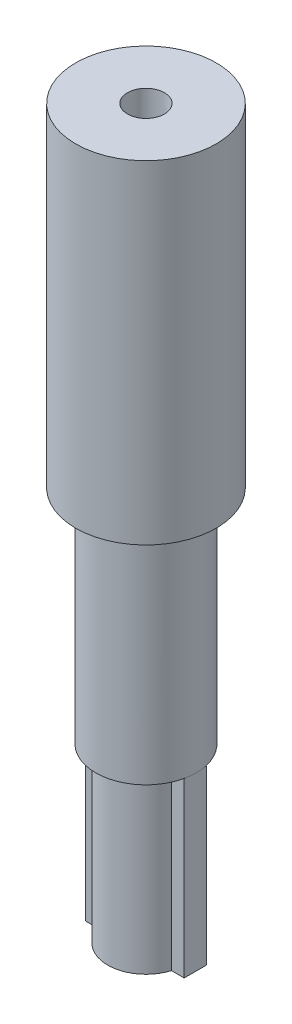
ISO-10303-21;
HEADER;
FILE_DESCRIPTION(('STEP AP214'),'2;1');
FILE_NAME('part.step','',(''),(''),'','','');
FILE_SCHEMA(('AUTOMOTIVE_DESIGN { 1 0 10303 214 1 1 1 1 }'));
ENDSEC;
DATA;
#1=APPLICATION_CONTEXT('core data for automotive mechanical design processes');
#2=APPLICATION_PROTOCOL_DEFINITION('international standard','automotive_design',2000,#1);
#3=PRODUCT_CONTEXT('',#1,'mechanical');
#4=PRODUCT('Part','Part','',(#3));
#5=PRODUCT_RELATED_PRODUCT_CATEGORY('part','',(#4));
#6=PRODUCT_DEFINITION_FORMATION('','',#4);
#7=PRODUCT_DEFINITION_CONTEXT('part definition',#1,'design');
#8=PRODUCT_DEFINITION('design','',#6,#7);
#9=PRODUCT_DEFINITION_SHAPE('','',#8);
#10=(LENGTH_UNIT() NAMED_UNIT(*) SI_UNIT(.MILLI.,.METRE.));
#11=(NAMED_UNIT(*) PLANE_ANGLE_UNIT() SI_UNIT($,.RADIAN.));
#12=(NAMED_UNIT(*) SI_UNIT($,.STERADIAN.) SOLID_ANGLE_UNIT());
#13=UNCERTAINTY_MEASURE_WITH_UNIT(LENGTH_MEASURE(1.E-05),#10,'distance_accuracy_value','');
#14=(GEOMETRIC_REPRESENTATION_CONTEXT(3) GLOBAL_UNCERTAINTY_ASSIGNED_CONTEXT((#13)) GLOBAL_UNIT_ASSIGNED_CONTEXT((#10,
#11,#12)) REPRESENTATION_CONTEXT('',''));
#15=CARTESIAN_POINT('',(0.,0.,0.));
#16=DIRECTION('',(0.,0.,1.));
#17=DIRECTION('',(1.,0.,0.));
#18=AXIS2_PLACEMENT_3D('',#15,#16,#17);
#19=CARTESIAN_POINT('',(0.,14.,0.));
#20=DIRECTION('',(0.,1.,0.));
#21=DIRECTION('',(0.,0.,1.));
#22=AXIS2_PLACEMENT_3D('',#19,#20,#21);
#23=PLANE('',#22);
#24=CARTESIAN_POINT('',(0.,14.,0.));
#25=DIRECTION('',(0.,1.,0.));
#26=DIRECTION('',(0.,0.,1.));
#27=AXIS2_PLACEMENT_3D('',#24,#25,#26);
#28=CIRCLE('',#27,4.075);
#29=CARTESIAN_POINT('',(3.9743710194193,14.,0.9));
#30=VERTEX_POINT('',#29);
#31=CARTESIAN_POINT('',(4.,14.,0.778219120813672));
#32=VERTEX_POINT('',#31);
#33=EDGE_CURVE('E160',#30,#32,#28,.T.);
#34=ORIENTED_EDGE('',*,*,#33,.F.);
#35=DIRECTION('',(1.,0.,0.));
#36=VECTOR('',#35,1.);
#37=CARTESIAN_POINT('',(0.,14.,0.9));
#38=LINE('',#37,#36);
#39=CARTESIAN_POINT('',(4.,14.,0.9));
#40=VERTEX_POINT('',#39);
#41=EDGE_CURVE('E246',#30,#40,#38,.T.);
#42=ORIENTED_EDGE('',*,*,#41,.T.);
#43=DIRECTION('',(0.,0.,1.));
#44=VECTOR('',#43,1.);
#45=CARTESIAN_POINT('',(4.,14.,0.));
#46=LINE('',#45,#44);
#47=EDGE_CURVE('E244',#32,#40,#46,.T.);
#48=ORIENTED_EDGE('',*,*,#47,.F.);
#49=EDGE_LOOP('',(#34,#42,#48));
#50=FACE_BOUND('',#49,.T.);
#51=ADVANCED_FACE('F41',(#50),#23,.T.);
#52=CARTESIAN_POINT('',(4.,14.,-0.778219120813672));
#53=VERTEX_POINT('',#52);
#54=CARTESIAN_POINT('',(3.9743710194193,14.,-0.9));
#55=VERTEX_POINT('',#54);
#56=EDGE_CURVE('E11',#53,#55,#28,.T.);
#57=ORIENTED_EDGE('',*,*,#56,.F.);
#58=CARTESIAN_POINT('',(4.,14.,-0.9));
#59=VERTEX_POINT('',#58);
#60=EDGE_CURVE('E251',#59,#53,#46,.T.);
#61=ORIENTED_EDGE('',*,*,#60,.F.);
#62=DIRECTION('',(1.,0.,0.));
#63=VECTOR('',#62,1.);
#64=CARTESIAN_POINT('',(0.,14.,-0.9));
#65=LINE('',#64,#63);
#66=EDGE_CURVE('E252',#55,#59,#65,.T.);
#67=ORIENTED_EDGE('',*,*,#66,.F.);
#68=EDGE_LOOP('',(#57,#61,#67));
#69=FACE_BOUND('',#68,.T.);
#70=ADVANCED_FACE('F257',(#69),#23,.T.);
#71=CARTESIAN_POINT('',(-3.9743710194193,14.,-0.9));
#72=VERTEX_POINT('',#71);
#73=CARTESIAN_POINT('',(-4.,14.,-0.778219120813672));
#74=VERTEX_POINT('',#73);
#75=EDGE_CURVE('E50',#72,#74,#28,.T.);
#76=ORIENTED_EDGE('',*,*,#75,.F.);
#77=DIRECTION('',(1.,0.,0.));
#78=VECTOR('',#77,1.);
#79=CARTESIAN_POINT('',(0.,14.,-0.9));
#80=LINE('',#79,#78);
#81=CARTESIAN_POINT('',(-4.,14.,-0.9));
#82=VERTEX_POINT('',#81);
#83=EDGE_CURVE('E188',#82,#72,#80,.T.);
#84=ORIENTED_EDGE('',*,*,#83,.F.);
#85=DIRECTION('',(0.,0.,1.));
#86=VECTOR('',#85,1.);
#87=CARTESIAN_POINT('',(-4.,14.,0.));
#88=LINE('',#87,#86);
#89=EDGE_CURVE('E193',#82,#74,#88,.T.);
#90=ORIENTED_EDGE('',*,*,#89,.T.);
#91=EDGE_LOOP('',(#76,#84,#90));
#92=FACE_BOUND('',#91,.T.);
#93=ADVANCED_FACE('F277',(#92),#23,.T.);
#94=CARTESIAN_POINT('',(0.,14.,0.9));
#95=DIRECTION('',(0.,0.,-1.));
#96=DIRECTION('',(-1.,0.,0.));
#97=AXIS2_PLACEMENT_3D('',#94,#95,#96);
#98=PLANE('',#97);
#99=DIRECTION('',(1.,0.,0.));
#100=VECTOR('',#99,1.);
#101=CARTESIAN_POINT('',(0.,0.,0.9));
#102=LINE('',#101,#100);
#103=CARTESIAN_POINT('',(-4.,0.,0.9));
#104=VERTEX_POINT('',#103);
#105=CARTESIAN_POINT('',(-2.96647939483826,0.,0.9));
#106=VERTEX_POINT('',#105);
#107=EDGE_CURVE('E170',#104,#106,#102,.T.);
#108=ORIENTED_EDGE('',*,*,#107,.T.);
#109=DIRECTION('',(0.,-1.,0.));
#110=VECTOR('',#109,1.);
#111=CARTESIAN_POINT('',(-2.96647939483826,14.,0.9));
#112=LINE('',#111,#110);
#113=CARTESIAN_POINT('',(-2.96647939483826,14.,0.9));
#114=VERTEX_POINT('',#113);
#115=EDGE_CURVE('E45',#114,#106,#112,.T.);
#116=ORIENTED_EDGE('',*,*,#115,.F.);
#117=DIRECTION('',(1.,0.,0.));
#118=VECTOR('',#117,1.);
#119=CARTESIAN_POINT('',(0.,14.,0.9));
#120=LINE('',#119,#118);
#121=CARTESIAN_POINT('',(-3.9743710194193,14.,0.9));
#122=VERTEX_POINT('',#121);
#123=EDGE_CURVE('E140',#122,#114,#120,.T.);
#124=ORIENTED_EDGE('',*,*,#123,.F.);
#125=CARTESIAN_POINT('',(-4.,14.,0.9));
#126=VERTEX_POINT('',#125);
#127=EDGE_CURVE('E132',#126,#122,#120,.T.);
#128=ORIENTED_EDGE('',*,*,#127,.F.);
#129=DIRECTION('',(0.,-1.,0.));
#130=VECTOR('',#129,1.);
#131=CARTESIAN_POINT('',(-4.,14.,0.9));
#132=LINE('',#131,#130);
#133=EDGE_CURVE('E195',#126,#104,#132,.T.);
#134=ORIENTED_EDGE('',*,*,#133,.T.);
#135=EDGE_LOOP('',(#108,#116,#124,#128,#134));
#136=FACE_BOUND('',#135,.T.);
#137=ADVANCED_FACE('F43',(#136),#98,.F.);
#138=CARTESIAN_POINT('',(0.,14.,0.));
#139=DIRECTION('',(0.,-1.,0.));
#140=DIRECTION('',(0.,0.,-1.));
#141=AXIS2_PLACEMENT_3D('',#138,#139,#140);
#142=CYLINDRICAL_SURFACE('',#141,3.1);
#143=CARTESIAN_POINT('',(0.,0.,0.));
#144=DIRECTION('',(0.,1.,0.));
#145=DIRECTION('',(0.,0.,1.));
#146=AXIS2_PLACEMENT_3D('',#143,#144,#145);
#147=CIRCLE('',#146,3.1);
#148=CARTESIAN_POINT('',(2.96647939483826,0.,0.9));
#149=VERTEX_POINT('',#148);
#150=EDGE_CURVE('E197',#106,#149,#147,.T.);
#151=ORIENTED_EDGE('',*,*,#150,.T.);
#152=DIRECTION('',(0.,-1.,0.));
#153=VECTOR('',#152,1.);
#154=CARTESIAN_POINT('',(2.96647939483826,14.,0.9));
#155=LINE('',#154,#153);
#156=CARTESIAN_POINT('',(2.96647939483826,14.,0.9));
#157=VERTEX_POINT('',#156);
#158=EDGE_CURVE('E165',#157,#149,#155,.T.);
#159=ORIENTED_EDGE('',*,*,#158,.F.);
#160=CARTESIAN_POINT('',(0.,14.,0.));
#161=DIRECTION('',(0.,1.,0.));
#162=DIRECTION('',(0.,0.,1.));
#163=AXIS2_PLACEMENT_3D('',#160,#161,#162);
#164=CIRCLE('',#163,3.1);
#165=EDGE_CURVE('E139',#114,#157,#164,.T.);
#166=ORIENTED_EDGE('',*,*,#165,.F.);
#167=ORIENTED_EDGE('',*,*,#115,.T.);
#168=EDGE_LOOP('',(#151,#159,#166,#167));
#169=FACE_BOUND('',#168,.T.);
#170=ADVANCED_FACE('F291',(#169),#142,.T.);
#171=CARTESIAN_POINT('',(0.,14.,0.9));
#172=DIRECTION('',(0.,0.,-1.));
#173=DIRECTION('',(-1.,0.,0.));
#174=AXIS2_PLACEMENT_3D('',#171,#172,#173);
#175=PLANE('',#174);
#176=DIRECTION('',(1.,0.,0.));
#177=VECTOR('',#176,1.);
#178=CARTESIAN_POINT('',(0.,0.,0.9));
#179=LINE('',#178,#177);
#180=CARTESIAN_POINT('',(4.,0.,0.9));
#181=VERTEX_POINT('',#180);
#182=EDGE_CURVE('E199',#149,#181,#179,.T.);
#183=ORIENTED_EDGE('',*,*,#182,.T.);
#184=DIRECTION('',(0.,-1.,0.));
#185=VECTOR('',#184,1.);
#186=CARTESIAN_POINT('',(4.,14.,0.9));
#187=LINE('',#186,#185);
#188=EDGE_CURVE('E224',#40,#181,#187,.T.);
#189=ORIENTED_EDGE('',*,*,#188,.F.);
#190=ORIENTED_EDGE('',*,*,#41,.F.);
#191=EDGE_CURVE('E155',#157,#30,#38,.T.);
#192=ORIENTED_EDGE('',*,*,#191,.F.);
#193=ORIENTED_EDGE('',*,*,#158,.T.);
#194=EDGE_LOOP('',(#183,#189,#190,#192,#193));
#195=FACE_BOUND('',#194,.T.);
#196=ADVANCED_FACE('F228',(#195),#175,.F.);
#197=CARTESIAN_POINT('',(4.,14.,0.));
#198=DIRECTION('',(1.,0.,0.));
#199=DIRECTION('',(0.,0.,-1.));
#200=AXIS2_PLACEMENT_3D('',#197,#198,#199);
#201=PLANE('',#200);
#202=DIRECTION('',(0.,0.,1.));
#203=VECTOR('',#202,1.);
#204=CARTESIAN_POINT('',(4.,0.,0.));
#205=LINE('',#204,#203);
#206=CARTESIAN_POINT('',(4.,0.,-0.9));
#207=VERTEX_POINT('',#206);
#208=EDGE_CURVE('E202',#207,#181,#205,.T.);
#209=ORIENTED_EDGE('',*,*,#208,.F.);
#210=DIRECTION('',(0.,-1.,0.));
#211=VECTOR('',#210,1.);
#212=CARTESIAN_POINT('',(4.,14.,-0.9));
#213=LINE('',#212,#211);
#214=EDGE_CURVE('E222',#59,#207,#213,.T.);
#215=ORIENTED_EDGE('',*,*,#214,.F.);
#216=ORIENTED_EDGE('',*,*,#60,.T.);
#217=EDGE_CURVE('E253',#53,#32,#46,.T.);
#218=ORIENTED_EDGE('',*,*,#217,.T.);
#219=ORIENTED_EDGE('',*,*,#47,.T.);
#220=ORIENTED_EDGE('',*,*,#188,.T.);
#221=EDGE_LOOP('',(#209,#215,#216,#218,#219,#220));
#222=FACE_BOUND('',#221,.T.);
#223=ADVANCED_FACE('F240',(#222),#201,.T.);
#224=CARTESIAN_POINT('',(0.,14.,-0.9));
#225=DIRECTION('',(0.,0.,-1.));
#226=DIRECTION('',(-1.,0.,0.));
#227=AXIS2_PLACEMENT_3D('',#224,#225,#226);
#228=PLANE('',#227);
#229=DIRECTION('',(1.,0.,0.));
#230=VECTOR('',#229,1.);
#231=CARTESIAN_POINT('',(0.,0.,-0.9));
#232=LINE('',#231,#230);
#233=CARTESIAN_POINT('',(2.96647939483826,0.,-0.9));
#234=VERTEX_POINT('',#233);
#235=EDGE_CURVE('E205',#234,#207,#232,.T.);
#236=ORIENTED_EDGE('',*,*,#235,.F.);
#237=DIRECTION('',(0.,-1.,0.));
#238=VECTOR('',#237,1.);
#239=CARTESIAN_POINT('',(2.96647939483826,14.,-0.9));
#240=LINE('',#239,#238);
#241=CARTESIAN_POINT('',(2.96647939483826,14.,-0.9));
#242=VERTEX_POINT('',#241);
#243=EDGE_CURVE('E220',#242,#234,#240,.T.);
#244=ORIENTED_EDGE('',*,*,#243,.F.);
#245=EDGE_CURVE('E181',#242,#55,#65,.T.);
#246=ORIENTED_EDGE('',*,*,#245,.T.);
#247=ORIENTED_EDGE('',*,*,#66,.T.);
#248=ORIENTED_EDGE('',*,*,#214,.T.);
#249=EDGE_LOOP('',(#236,#244,#246,#247,#248));
#250=FACE_BOUND('',#249,.T.);
#251=ADVANCED_FACE('F255',(#250),#228,.T.);
#252=CARTESIAN_POINT('',(0.,14.,0.));
#253=DIRECTION('',(0.,-1.,0.));
#254=DIRECTION('',(0.,0.,-1.));
#255=AXIS2_PLACEMENT_3D('',#252,#253,#254);
#256=CYLINDRICAL_SURFACE('',#255,3.1);
#257=CARTESIAN_POINT('',(0.,0.,0.));
#258=DIRECTION('',(0.,1.,0.));
#259=DIRECTION('',(0.,0.,1.));
#260=AXIS2_PLACEMENT_3D('',#257,#258,#259);
#261=CIRCLE('',#260,3.1);
#262=CARTESIAN_POINT('',(-2.96647939483826,0.,-0.9));
#263=VERTEX_POINT('',#262);
#264=EDGE_CURVE('E208',#234,#263,#261,.T.);
#265=ORIENTED_EDGE('',*,*,#264,.T.);
#266=DIRECTION('',(0.,-1.,0.));
#267=VECTOR('',#266,1.);
#268=CARTESIAN_POINT('',(-2.96647939483826,14.,-0.9));
#269=LINE('',#268,#267);
#270=CARTESIAN_POINT('',(-2.96647939483826,14.,-0.9));
#271=VERTEX_POINT('',#270);
#272=EDGE_CURVE('E218',#271,#263,#269,.T.);
#273=ORIENTED_EDGE('',*,*,#272,.F.);
#274=CARTESIAN_POINT('',(0.,14.,0.));
#275=DIRECTION('',(0.,1.,0.));
#276=DIRECTION('',(0.,0.,1.));
#277=AXIS2_PLACEMENT_3D('',#274,#275,#276);
#278=CIRCLE('',#277,3.1);
#279=EDGE_CURVE('E184',#242,#271,#278,.T.);
#280=ORIENTED_EDGE('',*,*,#279,.F.);
#281=ORIENTED_EDGE('',*,*,#243,.T.);
#282=EDGE_LOOP('',(#265,#273,#280,#281));
#283=FACE_BOUND('',#282,.T.);
#284=ADVANCED_FACE('F296',(#283),#256,.T.);
#285=CARTESIAN_POINT('',(0.,14.,-0.9));
#286=DIRECTION('',(0.,0.,-1.));
#287=DIRECTION('',(-1.,0.,0.));
#288=AXIS2_PLACEMENT_3D('',#285,#286,#287);
#289=PLANE('',#288);
#290=DIRECTION('',(1.,0.,0.));
#291=VECTOR('',#290,1.);
#292=CARTESIAN_POINT('',(0.,0.,-0.9));
#293=LINE('',#292,#291);
#294=CARTESIAN_POINT('',(-4.,0.,-0.9));
#295=VERTEX_POINT('',#294);
#296=EDGE_CURVE('E211',#295,#263,#293,.T.);
#297=ORIENTED_EDGE('',*,*,#296,.F.);
#298=DIRECTION('',(0.,-1.,0.));
#299=VECTOR('',#298,1.);
#300=CARTESIAN_POINT('',(-4.,14.,-0.9));
#301=LINE('',#300,#299);
#302=EDGE_CURVE('E216',#82,#295,#301,.T.);
#303=ORIENTED_EDGE('',*,*,#302,.F.);
#304=ORIENTED_EDGE('',*,*,#83,.T.);
#305=EDGE_CURVE('E182',#72,#271,#80,.T.);
#306=ORIENTED_EDGE('',*,*,#305,.T.);
#307=ORIENTED_EDGE('',*,*,#272,.T.);
#308=EDGE_LOOP('',(#297,#303,#304,#306,#307));
#309=FACE_BOUND('',#308,.T.);
#310=ADVANCED_FACE('F284',(#309),#289,.T.);
#311=CARTESIAN_POINT('',(-4.,14.,0.));
#312=DIRECTION('',(1.,0.,0.));
#313=DIRECTION('',(0.,0.,-1.));
#314=AXIS2_PLACEMENT_3D('',#311,#312,#313);
#315=PLANE('',#314);
#316=DIRECTION('',(0.,0.,1.));
#317=VECTOR('',#316,1.);
#318=CARTESIAN_POINT('',(-4.,0.,0.));
#319=LINE('',#318,#317);
#320=EDGE_CURVE('E149',#295,#104,#319,.T.);
#321=ORIENTED_EDGE('',*,*,#320,.T.);
#322=ORIENTED_EDGE('',*,*,#133,.F.);
#323=CARTESIAN_POINT('',(-4.,14.,0.778219120813672));
#324=VERTEX_POINT('',#323);
#325=EDGE_CURVE('E135',#324,#126,#88,.T.);
#326=ORIENTED_EDGE('',*,*,#325,.F.);
#327=EDGE_CURVE('E66',#74,#324,#88,.T.);
#328=ORIENTED_EDGE('',*,*,#327,.F.);
#329=ORIENTED_EDGE('',*,*,#89,.F.);
#330=ORIENTED_EDGE('',*,*,#302,.T.);
#331=EDGE_LOOP('',(#321,#322,#326,#328,#329,#330));
#332=FACE_BOUND('',#331,.T.);
#333=ADVANCED_FACE('F280',(#332),#315,.F.);
#334=EDGE_CURVE('E59',#324,#122,#28,.T.);
#335=ORIENTED_EDGE('',*,*,#334,.F.);
#336=ORIENTED_EDGE('',*,*,#325,.T.);
#337=ORIENTED_EDGE('',*,*,#127,.T.);
#338=EDGE_LOOP('',(#335,#336,#337));
#339=FACE_BOUND('',#338,.T.);
#340=ADVANCED_FACE('F134',(#339),#23,.T.);
#341=CARTESIAN_POINT('',(0.,0.,0.));
#342=DIRECTION('',(0.,1.,0.));
#343=DIRECTION('',(0.,0.,1.));
#344=AXIS2_PLACEMENT_3D('',#341,#342,#343);
#345=PLANE('',#344);
#346=ORIENTED_EDGE('',*,*,#107,.F.);
#347=ORIENTED_EDGE('',*,*,#320,.F.);
#348=ORIENTED_EDGE('',*,*,#296,.T.);
#349=ORIENTED_EDGE('',*,*,#264,.F.);
#350=ORIENTED_EDGE('',*,*,#235,.T.);
#351=ORIENTED_EDGE('',*,*,#208,.T.);
#352=ORIENTED_EDGE('',*,*,#182,.F.);
#353=ORIENTED_EDGE('',*,*,#150,.F.);
#354=EDGE_LOOP('',(#346,#347,#348,#349,#350,#351,#352,#353));
#355=FACE_BOUND('',#354,.T.);
#356=ADVANCED_FACE('F234',(#355),#345,.F.);
#357=CARTESIAN_POINT('',(0.,14.,0.));
#358=DIRECTION('',(0.,1.,0.));
#359=DIRECTION('',(0.,0.,1.));
#360=AXIS2_PLACEMENT_3D('',#357,#358,#359);
#361=PLANE('',#360);
#362=EDGE_CURVE('E152',#122,#30,#28,.T.);
#363=ORIENTED_EDGE('',*,*,#362,.F.);
#364=ORIENTED_EDGE('',*,*,#123,.T.);
#365=ORIENTED_EDGE('',*,*,#165,.T.);
#366=ORIENTED_EDGE('',*,*,#191,.T.);
#367=EDGE_LOOP('',(#363,#364,#365,#366));
#368=FACE_BOUND('',#367,.T.);
#369=ADVANCED_FACE('F153',(#368),#361,.F.);
#370=ORIENTED_EDGE('',*,*,#217,.F.);
#371=EDGE_CURVE('E52',#32,#53,#28,.T.);
#372=ORIENTED_EDGE('',*,*,#371,.F.);
#373=EDGE_LOOP('',(#370,#372));
#374=FACE_BOUND('',#373,.T.);
#375=ADVANCED_FACE('F260',(#374),#361,.F.);
#376=EDGE_CURVE('E158',#74,#324,#28,.T.);
#377=ORIENTED_EDGE('',*,*,#376,.F.);
#378=ORIENTED_EDGE('',*,*,#327,.T.);
#379=EDGE_LOOP('',(#377,#378));
#380=FACE_BOUND('',#379,.T.);
#381=ADVANCED_FACE('F262',(#380),#361,.F.);
#382=CARTESIAN_POINT('',(0.,32.,0.));
#383=DIRECTION('',(0.,-1.,0.));
#384=DIRECTION('',(0.,0.,-1.));
#385=AXIS2_PLACEMENT_3D('',#382,#383,#384);
#386=CYLINDRICAL_SURFACE('',#385,4.075);
#387=CARTESIAN_POINT('',(0.,32.,0.));
#388=DIRECTION('',(0.,1.,0.));
#389=DIRECTION('',(0.,0.,1.));
#390=AXIS2_PLACEMENT_3D('',#387,#388,#389);
#391=CIRCLE('',#390,4.075);
#392=CARTESIAN_POINT('',(0.,32.,4.075));
#393=VERTEX_POINT('',#392);
#394=EDGE_CURVE('E167',#393,#393,#391,.T.);
#395=ORIENTED_EDGE('',*,*,#394,.F.);
#396=EDGE_LOOP('',(#395));
#397=FACE_BOUND('',#396,.T.);
#398=ORIENTED_EDGE('',*,*,#33,.T.);
#399=ORIENTED_EDGE('',*,*,#371,.T.);
#400=ORIENTED_EDGE('',*,*,#56,.T.);
#401=EDGE_CURVE('E171',#55,#72,#28,.T.);
#402=ORIENTED_EDGE('',*,*,#401,.T.);
#403=ORIENTED_EDGE('',*,*,#75,.T.);
#404=ORIENTED_EDGE('',*,*,#376,.T.);
#405=ORIENTED_EDGE('',*,*,#334,.T.);
#406=ORIENTED_EDGE('',*,*,#362,.T.);
#407=EDGE_LOOP('',(#398,#399,#400,#402,#403,#404,#405,#406));
#408=FACE_BOUND('',#407,.T.);
#409=ADVANCED_FACE('F162',(#397,#408),#386,.T.);
#410=ORIENTED_EDGE('',*,*,#245,.F.);
#411=ORIENTED_EDGE('',*,*,#279,.T.);
#412=ORIENTED_EDGE('',*,*,#305,.F.);
#413=ORIENTED_EDGE('',*,*,#401,.F.);
#414=EDGE_LOOP('',(#410,#411,#412,#413));
#415=FACE_BOUND('',#414,.T.);
#416=ADVANCED_FACE('F178',(#415),#361,.F.);
#417=CARTESIAN_POINT('',(0.,34.,0.));
#418=DIRECTION('',(0.,-1.,0.));
#419=DIRECTION('',(0.,0.,-1.));
#420=AXIS2_PLACEMENT_3D('',#417,#418,#419);
#421=CYLINDRICAL_SURFACE('',#420,5.7);
#422=CARTESIAN_POINT('',(0.,32.,0.));
#423=DIRECTION('',(0.,1.,0.));
#424=DIRECTION('',(0.,0.,1.));
#425=AXIS2_PLACEMENT_3D('',#422,#423,#424);
#426=CIRCLE('',#425,5.7);
#427=CARTESIAN_POINT('',(0.,32.,5.7));
#428=VERTEX_POINT('',#427);
#429=EDGE_CURVE('E159',#428,#428,#426,.T.);
#430=ORIENTED_EDGE('',*,*,#429,.T.);
#431=EDGE_LOOP('',(#430));
#432=FACE_BOUND('',#431,.T.);
#433=CARTESIAN_POINT('',(0.,59.,0.));
#434=DIRECTION('',(0.,1.,0.));
#435=DIRECTION('',(0.,0.,1.));
#436=AXIS2_PLACEMENT_3D('',#433,#434,#435);
#437=CIRCLE('',#436,5.7);
#438=CARTESIAN_POINT('',(0.,59.,5.7));
#439=VERTEX_POINT('',#438);
#440=EDGE_CURVE('E504',#439,#439,#437,.T.);
#441=ORIENTED_EDGE('',*,*,#440,.F.);
#442=EDGE_LOOP('',(#441));
#443=FACE_BOUND('',#442,.T.);
#444=ADVANCED_FACE('F448',(#432,#443),#421,.T.);
#445=CARTESIAN_POINT('',(0.,32.,0.));
#446=DIRECTION('',(0.,1.,0.));
#447=DIRECTION('',(0.,0.,1.));
#448=AXIS2_PLACEMENT_3D('',#445,#446,#447);
#449=PLANE('',#448);
#450=ORIENTED_EDGE('',*,*,#394,.T.);
#451=EDGE_LOOP('',(#450));
#452=FACE_BOUND('',#451,.T.);
#453=ORIENTED_EDGE('',*,*,#429,.F.);
#454=EDGE_LOOP('',(#453));
#455=FACE_BOUND('',#454,.T.);
#456=ADVANCED_FACE('F458',(#452,#455),#449,.F.);
#457=CARTESIAN_POINT('',(0.,59.,0.));
#458=DIRECTION('',(0.,1.,0.));
#459=DIRECTION('',(0.,0.,1.));
#460=AXIS2_PLACEMENT_3D('',#457,#458,#459);
#461=PLANE('',#460);
#462=CARTESIAN_POINT('',(0.,59.,0.));
#463=DIRECTION('',(0.,1.,0.));
#464=DIRECTION('',(0.,0.,1.));
#465=AXIS2_PLACEMENT_3D('',#462,#463,#464);
#466=CIRCLE('',#465,1.5);
#467=CARTESIAN_POINT('',(0.,59.,1.5));
#468=VERTEX_POINT('',#467);
#469=EDGE_CURVE('E505',#468,#468,#466,.T.);
#470=ORIENTED_EDGE('',*,*,#469,.F.);
#471=EDGE_LOOP('',(#470));
#472=FACE_BOUND('',#471,.T.);
#473=ORIENTED_EDGE('',*,*,#440,.T.);
#474=EDGE_LOOP('',(#473));
#475=FACE_BOUND('',#474,.T.);
#476=ADVANCED_FACE('F467',(#472,#475),#461,.T.);
#477=CARTESIAN_POINT('',(0.,42.,0.));
#478=DIRECTION('',(0.,1.,0.));
#479=DIRECTION('',(0.,0.,1.));
#480=AXIS2_PLACEMENT_3D('',#477,#478,#479);
#481=CYLINDRICAL_SURFACE('',#480,1.5);
#482=CARTESIAN_POINT('',(0.,42.,0.));
#483=DIRECTION('',(0.,1.,0.));
#484=DIRECTION('',(0.,0.,1.));
#485=AXIS2_PLACEMENT_3D('',#482,#483,#484);
#486=CIRCLE('',#485,1.5);
#487=CARTESIAN_POINT('',(0.,42.,1.5));
#488=VERTEX_POINT('',#487);
#489=EDGE_CURVE('E503',#488,#488,#486,.T.);
#490=ORIENTED_EDGE('',*,*,#489,.F.);
#491=EDGE_LOOP('',(#490));
#492=FACE_BOUND('',#491,.T.);
#493=ORIENTED_EDGE('',*,*,#469,.T.);
#494=EDGE_LOOP('',(#493));
#495=FACE_BOUND('',#494,.T.);
#496=ADVANCED_FACE('F477',(#492,#495),#481,.F.);
#497=CARTESIAN_POINT('',(0.,42.,0.));
#498=DIRECTION('',(0.,1.,0.));
#499=DIRECTION('',(0.,0.,1.));
#500=AXIS2_PLACEMENT_3D('',#497,#498,#499);
#501=PLANE('',#500);
#502=ORIENTED_EDGE('',*,*,#489,.T.);
#503=EDGE_LOOP('',(#502));
#504=FACE_BOUND('',#503,.T.);
#505=ADVANCED_FACE('F485',(#504),#501,.T.);
#506=CLOSED_SHELL('',(#51,#70,#93,#137,#170,#196,#223,#251,#284,#310,#333,#340,#356,#369,#375,
#381,#409,#416,#444,#456,#476,#496,#505));
#507=MANIFOLD_SOLID_BREP('B2',#506);
#508=ADVANCED_BREP_SHAPE_REPRESENTATION('',(#18,#507),#14);
#509=SHAPE_DEFINITION_REPRESENTATION(#9,#508);
ENDSEC;
END-ISO-10303-21;
